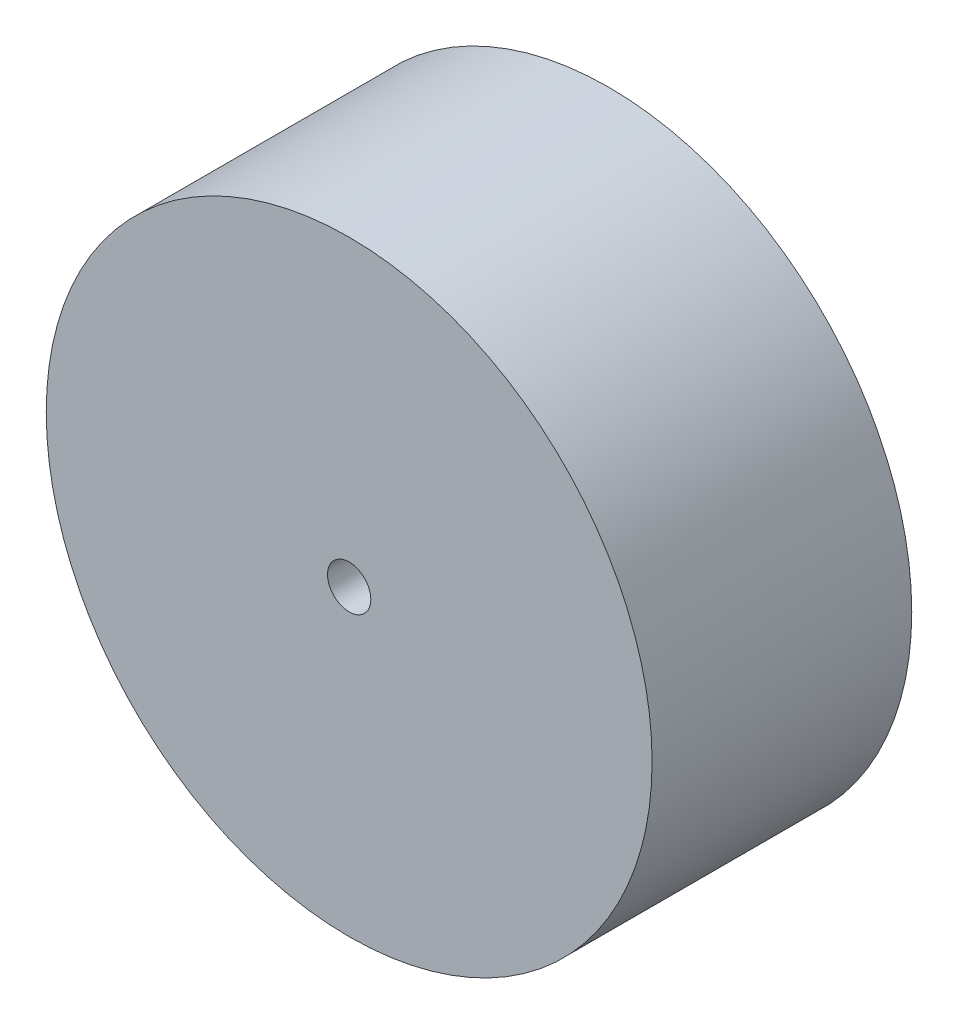
ISO-10303-21;
HEADER;
FILE_DESCRIPTION(('STEP AP214'),'2;1');
FILE_NAME('part.step','',(''),(''),'','','');
FILE_SCHEMA(('AUTOMOTIVE_DESIGN { 1 0 10303 214 1 1 1 1 }'));
ENDSEC;
DATA;
#1=APPLICATION_CONTEXT('core data for automotive mechanical design processes');
#2=APPLICATION_PROTOCOL_DEFINITION('international standard','automotive_design',2000,#1);
#3=PRODUCT_CONTEXT('',#1,'mechanical');
#4=PRODUCT('Part','Part','',(#3));
#5=PRODUCT_RELATED_PRODUCT_CATEGORY('part','',(#4));
#6=PRODUCT_DEFINITION_FORMATION('','',#4);
#7=PRODUCT_DEFINITION_CONTEXT('part definition',#1,'design');
#8=PRODUCT_DEFINITION('design','',#6,#7);
#9=PRODUCT_DEFINITION_SHAPE('','',#8);
#10=(LENGTH_UNIT() NAMED_UNIT(*) SI_UNIT(.MILLI.,.METRE.));
#11=(NAMED_UNIT(*) PLANE_ANGLE_UNIT() SI_UNIT($,.RADIAN.));
#12=(NAMED_UNIT(*) SI_UNIT($,.STERADIAN.) SOLID_ANGLE_UNIT());
#13=UNCERTAINTY_MEASURE_WITH_UNIT(LENGTH_MEASURE(1.E-05),#10,'distance_accuracy_value','');
#14=(GEOMETRIC_REPRESENTATION_CONTEXT(3) GLOBAL_UNCERTAINTY_ASSIGNED_CONTEXT((#13)) GLOBAL_UNIT_ASSIGNED_CONTEXT((#10,
#11,#12)) REPRESENTATION_CONTEXT('',''));
#15=CARTESIAN_POINT('',(0.,0.,0.));
#16=DIRECTION('',(0.,0.,1.));
#17=DIRECTION('',(1.,0.,0.));
#18=AXIS2_PLACEMENT_3D('',#15,#16,#17);
#19=CARTESIAN_POINT('',(0.,0.,30.48));
#20=DIRECTION('',(0.,0.,-1.));
#21=DIRECTION('',(-1.,0.,0.));
#22=AXIS2_PLACEMENT_3D('',#19,#20,#21);
#23=CYLINDRICAL_SURFACE('',#22,35.56);
#24=CARTESIAN_POINT('',(0.,0.,30.48));
#25=DIRECTION('',(0.,0.,1.));
#26=DIRECTION('',(1.,0.,0.));
#27=AXIS2_PLACEMENT_3D('',#24,#25,#26);
#28=CIRCLE('',#27,35.56);
#29=CARTESIAN_POINT('',(-35.56,0.,30.48));
#30=VERTEX_POINT('',#29);
#31=EDGE_CURVE('E10',#30,#30,#28,.T.);
#32=CARTESIAN_POINT('',(0.,0.,0.));
#33=DIRECTION('',(0.,0.,1.));
#34=DIRECTION('',(1.,0.,0.));
#35=AXIS2_PLACEMENT_3D('',#32,#33,#34);
#36=CIRCLE('',#35,35.56);
#37=CARTESIAN_POINT('',(-35.56,0.,0.));
#38=VERTEX_POINT('',#37);
#39=EDGE_CURVE('E40',#38,#38,#36,.T.);
#40=CARTESIAN_POINT('',(-35.56,0.,30.48));
#41=CARTESIAN_POINT('',(-35.56,0.,30.1625));
#42=CARTESIAN_POINT('',(-35.56,0.,29.845));
#43=CARTESIAN_POINT('',(-35.56,0.,29.21));
#44=CARTESIAN_POINT('',(-35.56,0.,28.8925));
#45=CARTESIAN_POINT('',(-35.56,0.,28.2575));
#46=CARTESIAN_POINT('',(-35.56,0.,27.94));
#47=CARTESIAN_POINT('',(-35.56,0.,27.305));
#48=CARTESIAN_POINT('',(-35.56,0.,26.9875));
#49=CARTESIAN_POINT('',(-35.56,0.,26.3525));
#50=CARTESIAN_POINT('',(-35.56,0.,26.035));
#51=CARTESIAN_POINT('',(-35.56,0.,25.4));
#52=CARTESIAN_POINT('',(-35.56,0.,25.0825));
#53=CARTESIAN_POINT('',(-35.56,0.,24.4475));
#54=CARTESIAN_POINT('',(-35.56,0.,24.13));
#55=CARTESIAN_POINT('',(-35.56,0.,23.495));
#56=CARTESIAN_POINT('',(-35.56,0.,23.1775));
#57=CARTESIAN_POINT('',(-35.56,0.,22.5425));
#58=CARTESIAN_POINT('',(-35.56,0.,22.225));
#59=CARTESIAN_POINT('',(-35.56,0.,21.59));
#60=CARTESIAN_POINT('',(-35.56,0.,21.2725));
#61=CARTESIAN_POINT('',(-35.56,0.,20.6375));
#62=CARTESIAN_POINT('',(-35.56,0.,20.32));
#63=CARTESIAN_POINT('',(-35.56,0.,19.685));
#64=CARTESIAN_POINT('',(-35.56,0.,19.3675));
#65=CARTESIAN_POINT('',(-35.56,0.,18.7325));
#66=CARTESIAN_POINT('',(-35.56,0.,18.415));
#67=CARTESIAN_POINT('',(-35.56,0.,17.78));
#68=CARTESIAN_POINT('',(-35.56,0.,17.4625));
#69=CARTESIAN_POINT('',(-35.56,0.,16.8275));
#70=CARTESIAN_POINT('',(-35.56,0.,16.51));
#71=CARTESIAN_POINT('',(-35.56,0.,15.875));
#72=CARTESIAN_POINT('',(-35.56,0.,15.5575));
#73=CARTESIAN_POINT('',(-35.56,0.,14.9225));
#74=CARTESIAN_POINT('',(-35.56,0.,14.605));
#75=CARTESIAN_POINT('',(-35.56,0.,13.97));
#76=CARTESIAN_POINT('',(-35.56,0.,13.6525));
#77=CARTESIAN_POINT('',(-35.56,0.,13.0175));
#78=CARTESIAN_POINT('',(-35.56,0.,12.7));
#79=CARTESIAN_POINT('',(-35.56,0.,12.065));
#80=CARTESIAN_POINT('',(-35.56,0.,11.7475));
#81=CARTESIAN_POINT('',(-35.56,0.,11.1125));
#82=CARTESIAN_POINT('',(-35.56,0.,10.795));
#83=CARTESIAN_POINT('',(-35.56,0.,10.16));
#84=CARTESIAN_POINT('',(-35.56,0.,9.8425));
#85=CARTESIAN_POINT('',(-35.56,0.,9.2075));
#86=CARTESIAN_POINT('',(-35.56,0.,8.89));
#87=CARTESIAN_POINT('',(-35.56,0.,8.255));
#88=CARTESIAN_POINT('',(-35.56,0.,7.9375));
#89=CARTESIAN_POINT('',(-35.56,0.,7.3025));
#90=CARTESIAN_POINT('',(-35.56,0.,6.985));
#91=CARTESIAN_POINT('',(-35.56,0.,6.35));
#92=CARTESIAN_POINT('',(-35.56,0.,6.0325));
#93=CARTESIAN_POINT('',(-35.56,0.,5.3975));
#94=CARTESIAN_POINT('',(-35.56,0.,5.08));
#95=CARTESIAN_POINT('',(-35.56,0.,4.445));
#96=CARTESIAN_POINT('',(-35.56,0.,4.1275));
#97=CARTESIAN_POINT('',(-35.56,0.,3.4925));
#98=CARTESIAN_POINT('',(-35.56,0.,3.175));
#99=CARTESIAN_POINT('',(-35.56,0.,2.54));
#100=CARTESIAN_POINT('',(-35.56,0.,2.2225));
#101=CARTESIAN_POINT('',(-35.56,0.,1.5875));
#102=CARTESIAN_POINT('',(-35.56,0.,1.27));
#103=CARTESIAN_POINT('',(-35.56,0.,0.634999999999999));
#104=CARTESIAN_POINT('',(-35.56,0.,0.3175));
#105=CARTESIAN_POINT('',(-35.56,0.,0.));
#106=B_SPLINE_CURVE_WITH_KNOTS('',3,(#40,#41,#42,#43,#44,#45,#46,#47,#48,#49,#50,#51,#52,#53,
#54,#55,#56,#57,#58,#59,#60,#61,#62,#63,#64,#65,#66,#67,#68,#69,#70,#71,#72,#73,#74,#75,#76,#77,
#78,#79,#80,#81,#82,#83,#84,#85,#86,#87,#88,#89,#90,#91,#92,#93,#94,#95,#96,#97,#98,#99,#100,
#101,#102,#103,#104,#105),.UNSPECIFIED.,.F.,.F.,(4,2,2,2,2,2,2,2,2,2,2,2,2,2,2,2,2,2,2,2,2,2,2,
2,2,2,2,2,2,2,2,2,4),(0.,0.952499999999998,1.905,2.8575,3.81,4.7625,5.715,6.6675,
7.61999999999999,8.5725,9.525,10.4775,11.43,12.3825,13.335,14.2875,15.24,16.1925,17.145,18.0975,
19.05,20.0025,20.955,21.9075,22.86,23.8125,24.765,25.7175,26.67,27.6225,28.575,29.5275,30.48),.UNSPECIFIED.);
#107=EDGE_CURVE('BSEAM37',#30,#38,#106,.T.);
#108=ORIENTED_EDGE('',*,*,#31,.F.);
#109=ORIENTED_EDGE('',*,*,#39,.T.);
#110=ORIENTED_EDGE('',*,*,#107,.T.);
#111=ORIENTED_EDGE('',*,*,#107,.F.);
#112=EDGE_LOOP('',(#108,#110,#109,#111));
#113=FACE_BOUND('',#112,.T.);
#114=ADVANCED_FACE('F37',(#113),#23,.T.);
#115=CARTESIAN_POINT('',(0.,0.,30.48));
#116=DIRECTION('',(0.,0.,1.));
#117=DIRECTION('',(1.,0.,0.));
#118=AXIS2_PLACEMENT_3D('',#115,#116,#117);
#119=PLANE('',#118);
#120=CARTESIAN_POINT('',(0.,0.,30.48));
#121=DIRECTION('',(0.,0.,1.));
#122=DIRECTION('',(1.,0.,0.));
#123=AXIS2_PLACEMENT_3D('',#120,#121,#122);
#124=CIRCLE('',#123,2.54);
#125=CARTESIAN_POINT('',(2.54,0.,30.48));
#126=VERTEX_POINT('',#125);
#127=EDGE_CURVE('E51',#126,#126,#124,.T.);
#128=ORIENTED_EDGE('',*,*,#127,.F.);
#129=EDGE_LOOP('',(#128));
#130=FACE_BOUND('',#129,.T.);
#131=ORIENTED_EDGE('',*,*,#31,.T.);
#132=EDGE_LOOP('',(#131));
#133=FACE_BOUND('',#132,.T.);
#134=ADVANCED_FACE('F68',(#130,#133),#119,.T.);
#135=CARTESIAN_POINT('',(0.,0.,0.));
#136=DIRECTION('',(0.,0.,1.));
#137=DIRECTION('',(1.,0.,0.));
#138=AXIS2_PLACEMENT_3D('',#135,#136,#137);
#139=PLANE('',#138);
#140=CARTESIAN_POINT('',(0.,0.,0.));
#141=DIRECTION('',(0.,0.,1.));
#142=DIRECTION('',(1.,0.,0.));
#143=AXIS2_PLACEMENT_3D('',#140,#141,#142);
#144=CIRCLE('',#143,2.54);
#145=CARTESIAN_POINT('',(2.54,0.,0.));
#146=VERTEX_POINT('',#145);
#147=EDGE_CURVE('E49',#146,#146,#144,.T.);
#148=ORIENTED_EDGE('',*,*,#147,.T.);
#149=EDGE_LOOP('',(#148));
#150=FACE_BOUND('',#149,.T.);
#151=ORIENTED_EDGE('',*,*,#39,.F.);
#152=EDGE_LOOP('',(#151));
#153=FACE_BOUND('',#152,.T.);
#154=ADVANCED_FACE('F59',(#150,#153),#139,.F.);
#155=CARTESIAN_POINT('',(0.,0.,0.));
#156=DIRECTION('',(0.,0.,1.));
#157=DIRECTION('',(1.,0.,0.));
#158=AXIS2_PLACEMENT_3D('',#155,#156,#157);
#159=CYLINDRICAL_SURFACE('',#158,2.54);
#160=CARTESIAN_POINT('',(2.54,0.,0.));
#161=CARTESIAN_POINT('',(2.54,0.,0.317499999999999));
#162=CARTESIAN_POINT('',(2.54,0.,0.635));
#163=CARTESIAN_POINT('',(2.54,0.,1.27));
#164=CARTESIAN_POINT('',(2.54,0.,1.5875));
#165=CARTESIAN_POINT('',(2.54,0.,2.2225));
#166=CARTESIAN_POINT('',(2.54,0.,2.54));
#167=CARTESIAN_POINT('',(2.54,0.,3.175));
#168=CARTESIAN_POINT('',(2.54,0.,3.4925));
#169=CARTESIAN_POINT('',(2.54,0.,4.1275));
#170=CARTESIAN_POINT('',(2.54,0.,4.445));
#171=CARTESIAN_POINT('',(2.54,0.,5.08));
#172=CARTESIAN_POINT('',(2.54,0.,5.3975));
#173=CARTESIAN_POINT('',(2.54,0.,6.0325));
#174=CARTESIAN_POINT('',(2.54,0.,6.35));
#175=CARTESIAN_POINT('',(2.54,0.,6.985));
#176=CARTESIAN_POINT('',(2.54,0.,7.3025));
#177=CARTESIAN_POINT('',(2.54,0.,7.9375));
#178=CARTESIAN_POINT('',(2.54,0.,8.255));
#179=CARTESIAN_POINT('',(2.54,0.,8.89));
#180=CARTESIAN_POINT('',(2.54,0.,9.2075));
#181=CARTESIAN_POINT('',(2.54,0.,9.8425));
#182=CARTESIAN_POINT('',(2.54,0.,10.16));
#183=CARTESIAN_POINT('',(2.54,0.,10.795));
#184=CARTESIAN_POINT('',(2.54,0.,11.1125));
#185=CARTESIAN_POINT('',(2.54,0.,11.7475));
#186=CARTESIAN_POINT('',(2.54,0.,12.065));
#187=CARTESIAN_POINT('',(2.54,0.,12.7));
#188=CARTESIAN_POINT('',(2.54,0.,13.0175));
#189=CARTESIAN_POINT('',(2.54,0.,13.6525));
#190=CARTESIAN_POINT('',(2.54,0.,13.97));
#191=CARTESIAN_POINT('',(2.54,0.,14.605));
#192=CARTESIAN_POINT('',(2.54,0.,14.9225));
#193=CARTESIAN_POINT('',(2.54,0.,15.5575));
#194=CARTESIAN_POINT('',(2.54,0.,15.875));
#195=CARTESIAN_POINT('',(2.54,0.,16.51));
#196=CARTESIAN_POINT('',(2.54,0.,16.8275));
#197=CARTESIAN_POINT('',(2.54,0.,17.4625));
#198=CARTESIAN_POINT('',(2.54,0.,17.78));
#199=CARTESIAN_POINT('',(2.54,0.,18.415));
#200=CARTESIAN_POINT('',(2.54,0.,18.7325));
#201=CARTESIAN_POINT('',(2.54,0.,19.3675));
#202=CARTESIAN_POINT('',(2.54,0.,19.685));
#203=CARTESIAN_POINT('',(2.54,0.,20.32));
#204=CARTESIAN_POINT('',(2.54,0.,20.6375));
#205=CARTESIAN_POINT('',(2.54,0.,21.2725));
#206=CARTESIAN_POINT('',(2.54,0.,21.59));
#207=CARTESIAN_POINT('',(2.54,0.,22.225));
#208=CARTESIAN_POINT('',(2.54,0.,22.5425));
#209=CARTESIAN_POINT('',(2.54,0.,23.1775));
#210=CARTESIAN_POINT('',(2.54,0.,23.495));
#211=CARTESIAN_POINT('',(2.54,0.,24.13));
#212=CARTESIAN_POINT('',(2.54,0.,24.4475));
#213=CARTESIAN_POINT('',(2.54,0.,25.0825));
#214=CARTESIAN_POINT('',(2.54,0.,25.4));
#215=CARTESIAN_POINT('',(2.54,0.,26.035));
#216=CARTESIAN_POINT('',(2.54,0.,26.3525));
#217=CARTESIAN_POINT('',(2.54,0.,26.9875));
#218=CARTESIAN_POINT('',(2.54,0.,27.305));
#219=CARTESIAN_POINT('',(2.54,0.,27.94));
#220=CARTESIAN_POINT('',(2.54,0.,28.2575));
#221=CARTESIAN_POINT('',(2.54,0.,28.8925));
#222=CARTESIAN_POINT('',(2.54,0.,29.21));
#223=CARTESIAN_POINT('',(2.54,0.,29.845));
#224=CARTESIAN_POINT('',(2.54,0.,30.1625));
#225=CARTESIAN_POINT('',(2.54,0.,30.48));
#226=B_SPLINE_CURVE_WITH_KNOTS('',3,(#160,#161,#162,#163,#164,#165,#166,#167,#168,#169,#170,
#171,#172,#173,#174,#175,#176,#177,#178,#179,#180,#181,#182,#183,#184,#185,#186,#187,#188,#189,
#190,#191,#192,#193,#194,#195,#196,#197,#198,#199,#200,#201,#202,#203,#204,#205,#206,#207,#208,
#209,#210,#211,#212,#213,#214,#215,#216,#217,#218,#219,#220,#221,#222,#223,#224,#225),
.UNSPECIFIED.,.F.,.F.,(4,2,2,2,2,2,2,2,2,2,2,2,2,2,2,2,2,2,2,2,2,2,2,2,2,2,2,2,2,2,2,2,4),(0.,
0.9525,1.905,2.8575,3.81,4.7625,5.715,6.6675,7.62,8.5725,9.525,10.4775,11.43,12.3825,13.335,
14.2875,15.24,16.1925,17.145,18.0975,19.05,20.0025,20.955,21.9075,22.86,23.8125,24.765,25.7175,
26.67,27.6225,28.575,29.5275,30.48),.UNSPECIFIED.);
#227=EDGE_CURVE('BSEAM62',#146,#126,#226,.T.);
#228=ORIENTED_EDGE('',*,*,#147,.F.);
#229=ORIENTED_EDGE('',*,*,#127,.T.);
#230=ORIENTED_EDGE('',*,*,#227,.T.);
#231=ORIENTED_EDGE('',*,*,#227,.F.);
#232=EDGE_LOOP('',(#228,#230,#229,#231));
#233=FACE_BOUND('',#232,.T.);
#234=ADVANCED_FACE('F62',(#233),#159,.F.);
#235=CLOSED_SHELL('',(#114,#134,#154,#234));
#236=MANIFOLD_SOLID_BREP('B2',#235);
#237=ADVANCED_BREP_SHAPE_REPRESENTATION('',(#18,#236),#14);
#238=SHAPE_DEFINITION_REPRESENTATION(#9,#237);
ENDSEC;
END-ISO-10303-21;
